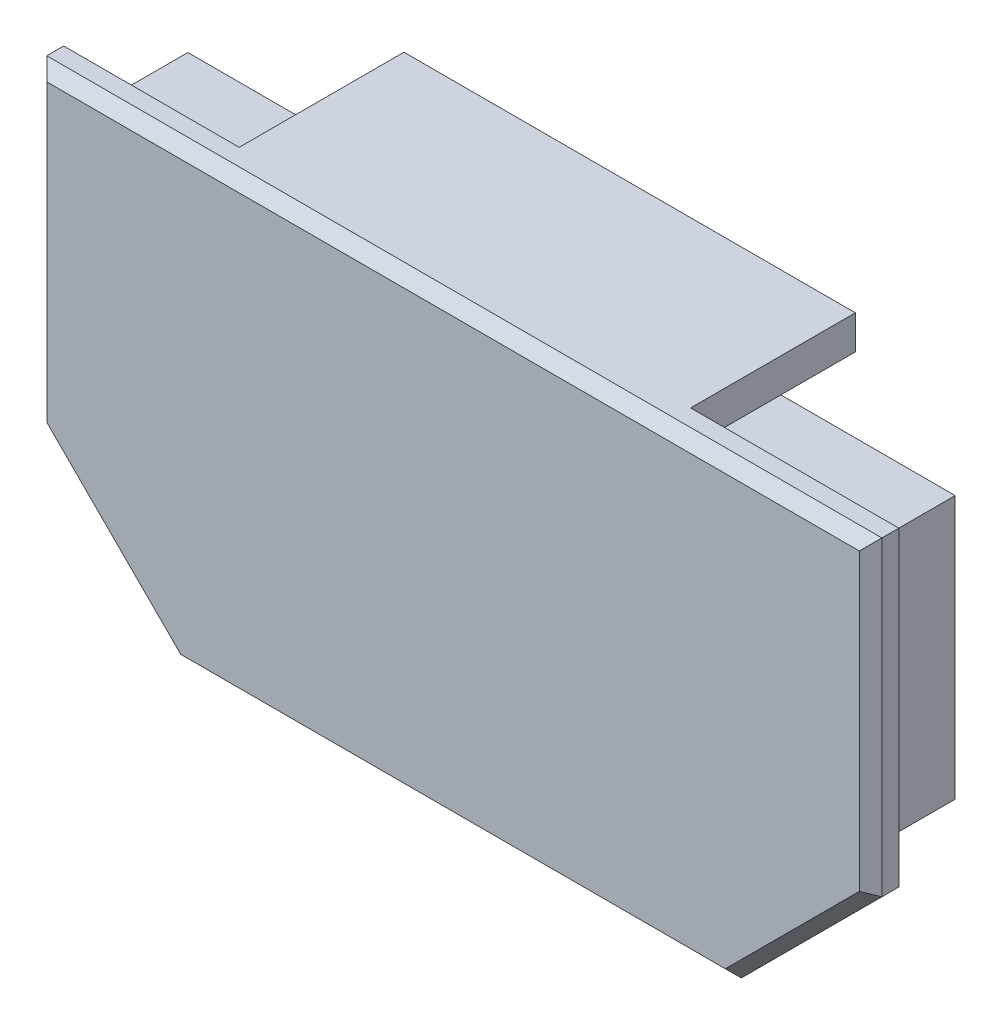
ISO-10303-21;
HEADER;
FILE_DESCRIPTION(('STEP AP214'),'2;1');
FILE_NAME('part.step','',(''),(''),'','','');
FILE_SCHEMA(('AUTOMOTIVE_DESIGN { 1 0 10303 214 1 1 1 1 }'));
ENDSEC;
DATA;
#1=APPLICATION_CONTEXT('core data for automotive mechanical design processes');
#2=APPLICATION_PROTOCOL_DEFINITION('international standard','automotive_design',2000,#1);
#3=PRODUCT_CONTEXT('',#1,'mechanical');
#4=PRODUCT('Part','Part','',(#3));
#5=PRODUCT_RELATED_PRODUCT_CATEGORY('part','',(#4));
#6=PRODUCT_DEFINITION_FORMATION('','',#4);
#7=PRODUCT_DEFINITION_CONTEXT('part definition',#1,'design');
#8=PRODUCT_DEFINITION('design','',#6,#7);
#9=PRODUCT_DEFINITION_SHAPE('','',#8);
#10=(LENGTH_UNIT() NAMED_UNIT(*) SI_UNIT(.MILLI.,.METRE.));
#11=(NAMED_UNIT(*) PLANE_ANGLE_UNIT() SI_UNIT($,.RADIAN.));
#12=(NAMED_UNIT(*) SI_UNIT($,.STERADIAN.) SOLID_ANGLE_UNIT());
#13=UNCERTAINTY_MEASURE_WITH_UNIT(LENGTH_MEASURE(1.E-05),#10,'distance_accuracy_value','');
#14=(GEOMETRIC_REPRESENTATION_CONTEXT(3) GLOBAL_UNCERTAINTY_ASSIGNED_CONTEXT((#13)) GLOBAL_UNIT_ASSIGNED_CONTEXT((#10,
#11,#12)) REPRESENTATION_CONTEXT('',''));
#15=CARTESIAN_POINT('',(0.,0.,0.));
#16=DIRECTION('',(0.,0.,1.));
#17=DIRECTION('',(1.,0.,0.));
#18=AXIS2_PLACEMENT_3D('',#15,#16,#17);
#19=CARTESIAN_POINT('',(-34.,17.,-8.));
#20=DIRECTION('',(0.,1.,0.));
#21=DIRECTION('',(0.,0.,1.));
#22=AXIS2_PLACEMENT_3D('',#19,#20,#21);
#23=PLANE('',#22);
#24=DIRECTION('',(-1.,0.,0.));
#25=VECTOR('',#24,1.);
#26=CARTESIAN_POINT('',(-34.,17.,-8.));
#27=LINE('',#26,#25);
#28=CARTESIAN_POINT('',(34.,17.,-8.));
#29=VERTEX_POINT('',#28);
#30=CARTESIAN_POINT('',(18.55,17.,-8.));
#31=VERTEX_POINT('',#30);
#32=EDGE_CURVE('E388',#29,#31,#27,.T.);
#33=ORIENTED_EDGE('',*,*,#32,.T.);
#34=DIRECTION('',(0.,0.,1.));
#35=VECTOR('',#34,1.);
#36=CARTESIAN_POINT('',(18.55,17.,-14.6));
#37=LINE('',#36,#35);
#38=CARTESIAN_POINT('',(18.55,17.,0.));
#39=VERTEX_POINT('',#38);
#40=EDGE_CURVE('E261',#31,#39,#37,.T.);
#41=ORIENTED_EDGE('',*,*,#40,.T.);
#42=DIRECTION('',(-1.,0.,0.));
#43=VECTOR('',#42,1.);
#44=CARTESIAN_POINT('',(-34.,17.,0.));
#45=LINE('',#44,#43);
#46=CARTESIAN_POINT('',(34.,17.,0.));
#47=VERTEX_POINT('',#46);
#48=EDGE_CURVE('E409',#47,#39,#45,.T.);
#49=ORIENTED_EDGE('',*,*,#48,.F.);
#50=DIRECTION('',(0.,0.,1.));
#51=VECTOR('',#50,1.);
#52=CARTESIAN_POINT('',(34.,17.,-8.));
#53=LINE('',#52,#51);
#54=EDGE_CURVE('E431',#29,#47,#53,.T.);
#55=ORIENTED_EDGE('',*,*,#54,.F.);
#56=EDGE_LOOP('',(#33,#41,#49,#55));
#57=FACE_BOUND('',#56,.T.);
#58=ADVANCED_FACE('F41',(#57),#23,.T.);
#59=CARTESIAN_POINT('',(-21.45,17.,0.));
#60=VERTEX_POINT('',#59);
#61=CARTESIAN_POINT('',(-34.,17.,0.));
#62=VERTEX_POINT('',#61);
#63=EDGE_CURVE('E407',#60,#62,#45,.T.);
#64=ORIENTED_EDGE('',*,*,#63,.F.);
#65=DIRECTION('',(0.,0.,1.));
#66=VECTOR('',#65,1.);
#67=CARTESIAN_POINT('',(-21.45,17.,-14.6));
#68=LINE('',#67,#66);
#69=CARTESIAN_POINT('',(-21.45,17.,-8.));
#70=VERTEX_POINT('',#69);
#71=EDGE_CURVE('E614',#70,#60,#68,.T.);
#72=ORIENTED_EDGE('',*,*,#71,.F.);
#73=CARTESIAN_POINT('',(-34.,17.,-8.));
#74=VERTEX_POINT('',#73);
#75=EDGE_CURVE('E389',#70,#74,#27,.T.);
#76=ORIENTED_EDGE('',*,*,#75,.T.);
#77=DIRECTION('',(0.,0.,1.));
#78=VECTOR('',#77,1.);
#79=CARTESIAN_POINT('',(-34.,17.,-8.));
#80=LINE('',#79,#78);
#81=EDGE_CURVE('E426',#74,#62,#80,.T.);
#82=ORIENTED_EDGE('',*,*,#81,.T.);
#83=EDGE_LOOP('',(#64,#72,#76,#82));
#84=FACE_BOUND('',#83,.T.);
#85=ADVANCED_FACE('F542',(#84),#23,.T.);
#86=CARTESIAN_POINT('',(0.,0.,0.));
#87=DIRECTION('',(0.,0.,1.));
#88=DIRECTION('',(1.,0.,0.));
#89=AXIS2_PLACEMENT_3D('',#86,#87,#88);
#90=PLANE('',#89);
#91=DIRECTION('',(0.,-1.,0.));
#92=VECTOR('',#91,1.);
#93=CARTESIAN_POINT('',(18.55,20.,0.));
#94=LINE('',#93,#92);
#95=CARTESIAN_POINT('',(18.55,20.,0.));
#96=VERTEX_POINT('',#95);
#97=EDGE_CURVE('E615',#96,#39,#94,.T.);
#98=ORIENTED_EDGE('',*,*,#97,.F.);
#99=DIRECTION('',(-1.,0.,0.));
#100=VECTOR('',#99,1.);
#101=CARTESIAN_POINT('',(-37.,20.,0.));
#102=LINE('',#101,#100);
#103=CARTESIAN_POINT('',(37.,20.,0.));
#104=VERTEX_POINT('',#103);
#105=EDGE_CURVE('E303',#104,#96,#102,.T.);
#106=ORIENTED_EDGE('',*,*,#105,.F.);
#107=DIRECTION('',(0.,1.,0.));
#108=VECTOR('',#107,1.);
#109=CARTESIAN_POINT('',(37.,-7.54264068711929,0.));
#110=LINE('',#109,#108);
#111=CARTESIAN_POINT('',(37.,-7.54264068711929,0.));
#112=VERTEX_POINT('',#111);
#113=EDGE_CURVE('E299',#112,#104,#110,.T.);
#114=ORIENTED_EDGE('',*,*,#113,.F.);
#115=DIRECTION('',(0.707106781186547,0.707106781186547,0.));
#116=VECTOR('',#115,1.);
#117=CARTESIAN_POINT('',(24.5426406871193,-20.,0.));
#118=LINE('',#117,#116);
#119=CARTESIAN_POINT('',(24.5426406871193,-20.,0.));
#120=VERTEX_POINT('',#119);
#121=EDGE_CURVE('E294',#120,#112,#118,.T.);
#122=ORIENTED_EDGE('',*,*,#121,.F.);
#123=DIRECTION('',(1.,0.,0.));
#124=VECTOR('',#123,1.);
#125=CARTESIAN_POINT('',(-24.5426406871193,-20.,0.));
#126=LINE('',#125,#124);
#127=CARTESIAN_POINT('',(4.,-20.,0.));
#128=VERTEX_POINT('',#127);
#129=EDGE_CURVE('E298',#128,#120,#126,.T.);
#130=ORIENTED_EDGE('',*,*,#129,.F.);
#131=DIRECTION('',(0.,-1.,0.));
#132=VECTOR('',#131,1.);
#133=CARTESIAN_POINT('',(4.,-8.93774225170146,0.));
#134=LINE('',#133,#132);
#135=CARTESIAN_POINT('',(4.,-17.,0.));
#136=VERTEX_POINT('',#135);
#137=EDGE_CURVE('E287',#136,#128,#134,.T.);
#138=ORIENTED_EDGE('',*,*,#137,.F.);
#139=DIRECTION('',(1.,0.,0.));
#140=VECTOR('',#139,1.);
#141=CARTESIAN_POINT('',(-23.3,-17.,0.));
#142=LINE('',#141,#140);
#143=CARTESIAN_POINT('',(23.3,-17.,0.));
#144=VERTEX_POINT('',#143);
#145=EDGE_CURVE('E420',#136,#144,#142,.T.);
#146=ORIENTED_EDGE('',*,*,#145,.T.);
#147=DIRECTION('',(0.707106781186547,0.707106781186547,0.));
#148=VECTOR('',#147,1.);
#149=CARTESIAN_POINT('',(23.3,-17.,0.));
#150=LINE('',#149,#148);
#151=CARTESIAN_POINT('',(34.,-6.30000000000001,0.));
#152=VERTEX_POINT('',#151);
#153=EDGE_CURVE('E366',#144,#152,#150,.T.);
#154=ORIENTED_EDGE('',*,*,#153,.T.);
#155=DIRECTION('',(0.,1.,0.));
#156=VECTOR('',#155,1.);
#157=CARTESIAN_POINT('',(34.,-6.30000000000001,0.));
#158=LINE('',#157,#156);
#159=EDGE_CURVE('E404',#152,#47,#158,.T.);
#160=ORIENTED_EDGE('',*,*,#159,.T.);
#161=ORIENTED_EDGE('',*,*,#48,.T.);
#162=EDGE_LOOP('',(#98,#106,#114,#122,#130,#138,#146,#154,#160,#161));
#163=FACE_BOUND('',#162,.T.);
#164=ADVANCED_FACE('F489',(#163),#90,.F.);
#165=DIRECTION('',(0.,1.,0.));
#166=VECTOR('',#165,1.);
#167=CARTESIAN_POINT('',(-21.45,20.,0.));
#168=LINE('',#167,#166);
#169=CARTESIAN_POINT('',(-21.45,20.,0.));
#170=VERTEX_POINT('',#169);
#171=EDGE_CURVE('E258',#60,#170,#168,.T.);
#172=ORIENTED_EDGE('',*,*,#171,.F.);
#173=ORIENTED_EDGE('',*,*,#63,.T.);
#174=DIRECTION('',(0.,-1.,0.));
#175=VECTOR('',#174,1.);
#176=CARTESIAN_POINT('',(-34.,17.,0.));
#177=LINE('',#176,#175);
#178=CARTESIAN_POINT('',(-34.,-6.30000000000002,0.));
#179=VERTEX_POINT('',#178);
#180=EDGE_CURVE('E413',#62,#179,#177,.T.);
#181=ORIENTED_EDGE('',*,*,#180,.T.);
#182=DIRECTION('',(0.707106781186548,-0.707106781186547,0.));
#183=VECTOR('',#182,1.);
#184=CARTESIAN_POINT('',(-34.,-6.30000000000002,0.));
#185=LINE('',#184,#183);
#186=CARTESIAN_POINT('',(-23.3,-17.,0.));
#187=VERTEX_POINT('',#186);
#188=EDGE_CURVE('E412',#179,#187,#185,.T.);
#189=ORIENTED_EDGE('',*,*,#188,.T.);
#190=CARTESIAN_POINT('',(-4.,-17.,0.));
#191=VERTEX_POINT('',#190);
#192=EDGE_CURVE('E383',#187,#191,#142,.T.);
#193=ORIENTED_EDGE('',*,*,#192,.T.);
#194=DIRECTION('',(0.,-1.,0.));
#195=VECTOR('',#194,1.);
#196=CARTESIAN_POINT('',(-4.,-8.93774225170146,0.));
#197=LINE('',#196,#195);
#198=CARTESIAN_POINT('',(-4.,-20.,0.));
#199=VERTEX_POINT('',#198);
#200=EDGE_CURVE('E70',#191,#199,#197,.T.);
#201=ORIENTED_EDGE('',*,*,#200,.T.);
#202=CARTESIAN_POINT('',(-24.5426406871193,-20.,0.));
#203=VERTEX_POINT('',#202);
#204=EDGE_CURVE('E292',#203,#199,#126,.T.);
#205=ORIENTED_EDGE('',*,*,#204,.F.);
#206=DIRECTION('',(0.707106781186547,-0.707106781186547,0.));
#207=VECTOR('',#206,1.);
#208=CARTESIAN_POINT('',(-37.,-7.54264068711929,0.));
#209=LINE('',#208,#207);
#210=CARTESIAN_POINT('',(-37.,-7.54264068711929,0.));
#211=VERTEX_POINT('',#210);
#212=EDGE_CURVE('E307',#211,#203,#209,.T.);
#213=ORIENTED_EDGE('',*,*,#212,.F.);
#214=DIRECTION('',(0.,-1.,0.));
#215=VECTOR('',#214,1.);
#216=CARTESIAN_POINT('',(-37.,20.,0.));
#217=LINE('',#216,#215);
#218=CARTESIAN_POINT('',(-37.,20.,0.));
#219=VERTEX_POINT('',#218);
#220=EDGE_CURVE('E306',#219,#211,#217,.T.);
#221=ORIENTED_EDGE('',*,*,#220,.F.);
#222=EDGE_CURVE('E305',#170,#219,#102,.T.);
#223=ORIENTED_EDGE('',*,*,#222,.F.);
#224=EDGE_LOOP('',(#172,#173,#181,#189,#193,#201,#205,#213,#221,#223));
#225=FACE_BOUND('',#224,.T.);
#226=ADVANCED_FACE('F564',(#225),#90,.F.);
#227=CARTESIAN_POINT('',(23.3,-17.,-8.));
#228=DIRECTION('',(0.707106781186547,-0.707106781186547,0.));
#229=DIRECTION('',(0.707106781186548,0.707106781186548,0.));
#230=AXIS2_PLACEMENT_3D('',#227,#228,#229);
#231=PLANE('',#230);
#232=ORIENTED_EDGE('',*,*,#153,.F.);
#233=DIRECTION('',(0.,0.,1.));
#234=VECTOR('',#233,1.);
#235=CARTESIAN_POINT('',(23.3,-17.,-8.));
#236=LINE('',#235,#234);
#237=CARTESIAN_POINT('',(23.3,-17.,-8.));
#238=VERTEX_POINT('',#237);
#239=EDGE_CURVE('E419',#238,#144,#236,.T.);
#240=ORIENTED_EDGE('',*,*,#239,.F.);
#241=DIRECTION('',(0.707106781186547,0.707106781186547,0.));
#242=VECTOR('',#241,1.);
#243=CARTESIAN_POINT('',(23.3,-17.,-8.));
#244=LINE('',#243,#242);
#245=CARTESIAN_POINT('',(34.,-6.30000000000001,-8.));
#246=VERTEX_POINT('',#245);
#247=EDGE_CURVE('E382',#238,#246,#244,.T.);
#248=ORIENTED_EDGE('',*,*,#247,.T.);
#249=DIRECTION('',(0.,0.,1.));
#250=VECTOR('',#249,1.);
#251=CARTESIAN_POINT('',(34.,-6.30000000000001,-8.));
#252=LINE('',#251,#250);
#253=EDGE_CURVE('E402',#246,#152,#252,.T.);
#254=ORIENTED_EDGE('',*,*,#253,.T.);
#255=EDGE_LOOP('',(#232,#240,#248,#254));
#256=FACE_BOUND('',#255,.T.);
#257=ADVANCED_FACE('F561',(#256),#231,.T.);
#258=CARTESIAN_POINT('',(-23.3,-17.,-8.));
#259=DIRECTION('',(0.,-1.,0.));
#260=DIRECTION('',(1.,0.,0.));
#261=AXIS2_PLACEMENT_3D('',#258,#259,#260);
#262=PLANE('',#261);
#263=ORIENTED_EDGE('',*,*,#192,.F.);
#264=DIRECTION('',(0.,0.,1.));
#265=VECTOR('',#264,1.);
#266=CARTESIAN_POINT('',(-23.3,-17.,-8.));
#267=LINE('',#266,#265);
#268=CARTESIAN_POINT('',(-23.3,-17.,-8.));
#269=VERTEX_POINT('',#268);
#270=EDGE_CURVE('E425',#269,#187,#267,.T.);
#271=ORIENTED_EDGE('',*,*,#270,.F.);
#272=DIRECTION('',(1.,0.,0.));
#273=VECTOR('',#272,1.);
#274=CARTESIAN_POINT('',(-23.3,-17.,-8.));
#275=LINE('',#274,#273);
#276=EDGE_CURVE('E396',#269,#238,#275,.T.);
#277=ORIENTED_EDGE('',*,*,#276,.T.);
#278=ORIENTED_EDGE('',*,*,#239,.T.);
#279=ORIENTED_EDGE('',*,*,#145,.F.);
#280=DIRECTION('',(0.866025403784442,0.,-0.499999999999995));
#281=VECTOR('',#280,1.);
#282=CARTESIAN_POINT('',(4.,-17.,0.));
#283=LINE('',#282,#281);
#284=CARTESIAN_POINT('',(2.2679491924311,-17.,1.));
#285=VERTEX_POINT('',#284);
#286=EDGE_CURVE('E272',#285,#136,#283,.T.);
#287=ORIENTED_EDGE('',*,*,#286,.F.);
#288=DIRECTION('',(1.,0.,0.));
#289=VECTOR('',#288,1.);
#290=CARTESIAN_POINT('',(2.2679491924311,-17.,1.));
#291=LINE('',#290,#289);
#292=CARTESIAN_POINT('',(-2.2679491924311,-17.,1.));
#293=VERTEX_POINT('',#292);
#294=EDGE_CURVE('E271',#293,#285,#291,.T.);
#295=ORIENTED_EDGE('',*,*,#294,.F.);
#296=DIRECTION('',(0.866025403784442,0.,0.499999999999995));
#297=VECTOR('',#296,1.);
#298=CARTESIAN_POINT('',(-2.2679491924311,-17.,1.));
#299=LINE('',#298,#297);
#300=EDGE_CURVE('E276',#191,#293,#299,.T.);
#301=ORIENTED_EDGE('',*,*,#300,.F.);
#302=EDGE_LOOP('',(#263,#271,#277,#278,#279,#287,#295,#301));
#303=FACE_BOUND('',#302,.T.);
#304=ADVANCED_FACE('F562',(#303),#262,.T.);
#305=CARTESIAN_POINT('',(-34.,-6.30000000000002,-8.));
#306=DIRECTION('',(-0.707106781186547,-0.707106781186548,0.));
#307=DIRECTION('',(0.707106781186548,-0.707106781186547,0.));
#308=AXIS2_PLACEMENT_3D('',#305,#306,#307);
#309=PLANE('',#308);
#310=ORIENTED_EDGE('',*,*,#188,.F.);
#311=DIRECTION('',(0.,0.,1.));
#312=VECTOR('',#311,1.);
#313=CARTESIAN_POINT('',(-34.,-6.30000000000002,-8.));
#314=LINE('',#313,#312);
#315=CARTESIAN_POINT('',(-34.,-6.30000000000002,-8.));
#316=VERTEX_POINT('',#315);
#317=EDGE_CURVE('E428',#316,#179,#314,.T.);
#318=ORIENTED_EDGE('',*,*,#317,.F.);
#319=DIRECTION('',(0.707106781186548,-0.707106781186547,0.));
#320=VECTOR('',#319,1.);
#321=CARTESIAN_POINT('',(-34.,-6.30000000000002,-8.));
#322=LINE('',#321,#320);
#323=EDGE_CURVE('E394',#316,#269,#322,.T.);
#324=ORIENTED_EDGE('',*,*,#323,.T.);
#325=ORIENTED_EDGE('',*,*,#270,.T.);
#326=EDGE_LOOP('',(#310,#318,#324,#325));
#327=FACE_BOUND('',#326,.T.);
#328=ADVANCED_FACE('F624',(#327),#309,.T.);
#329=CARTESIAN_POINT('',(-34.,17.,-8.));
#330=DIRECTION('',(-1.,0.,0.));
#331=DIRECTION('',(0.,-1.,0.));
#332=AXIS2_PLACEMENT_3D('',#329,#330,#331);
#333=PLANE('',#332);
#334=ORIENTED_EDGE('',*,*,#180,.F.);
#335=ORIENTED_EDGE('',*,*,#81,.F.);
#336=DIRECTION('',(0.,-1.,0.));
#337=VECTOR('',#336,1.);
#338=CARTESIAN_POINT('',(-34.,17.,-8.));
#339=LINE('',#338,#337);
#340=EDGE_CURVE('E395',#74,#316,#339,.T.);
#341=ORIENTED_EDGE('',*,*,#340,.T.);
#342=ORIENTED_EDGE('',*,*,#317,.T.);
#343=EDGE_LOOP('',(#334,#335,#341,#342));
#344=FACE_BOUND('',#343,.T.);
#345=ADVANCED_FACE('F555',(#344),#333,.T.);
#346=CARTESIAN_POINT('',(34.,-6.30000000000001,-8.));
#347=DIRECTION('',(1.,0.,0.));
#348=DIRECTION('',(0.,0.,-1.));
#349=AXIS2_PLACEMENT_3D('',#346,#347,#348);
#350=PLANE('',#349);
#351=ORIENTED_EDGE('',*,*,#159,.F.);
#352=ORIENTED_EDGE('',*,*,#253,.F.);
#353=DIRECTION('',(0.,1.,0.));
#354=VECTOR('',#353,1.);
#355=CARTESIAN_POINT('',(34.,-6.30000000000001,-8.));
#356=LINE('',#355,#354);
#357=EDGE_CURVE('E381',#246,#29,#356,.T.);
#358=ORIENTED_EDGE('',*,*,#357,.T.);
#359=ORIENTED_EDGE('',*,*,#54,.T.);
#360=EDGE_LOOP('',(#351,#352,#358,#359));
#361=FACE_BOUND('',#360,.T.);
#362=ADVANCED_FACE('F558',(#361),#350,.T.);
#363=CARTESIAN_POINT('',(0.,0.,-8.));
#364=DIRECTION('',(0.,0.,-1.));
#365=DIRECTION('',(-1.,0.,0.));
#366=AXIS2_PLACEMENT_3D('',#363,#364,#365);
#367=PLANE('',#366);
#368=DIRECTION('',(0.707106781186548,0.707106781186548,0.));
#369=VECTOR('',#368,1.);
#370=CARTESIAN_POINT('',(22.4715728752538,-15.,-8.));
#371=LINE('',#370,#369);
#372=CARTESIAN_POINT('',(22.4715728752538,-15.,-8.));
#373=VERTEX_POINT('',#372);
#374=CARTESIAN_POINT('',(32.,-5.47157287525382,-8.));
#375=VERTEX_POINT('',#374);
#376=EDGE_CURVE('E330',#373,#375,#371,.T.);
#377=ORIENTED_EDGE('',*,*,#376,.T.);
#378=DIRECTION('',(0.,1.,0.));
#379=VECTOR('',#378,1.);
#380=CARTESIAN_POINT('',(32.,-5.47157287525382,-8.));
#381=LINE('',#380,#379);
#382=CARTESIAN_POINT('',(32.,15.,-8.));
#383=VERTEX_POINT('',#382);
#384=EDGE_CURVE('E329',#375,#383,#381,.T.);
#385=ORIENTED_EDGE('',*,*,#384,.T.);
#386=DIRECTION('',(-1.,0.,0.));
#387=VECTOR('',#386,1.);
#388=CARTESIAN_POINT('',(-32.,15.,-8.));
#389=LINE('',#388,#387);
#390=CARTESIAN_POINT('',(-32.,15.,-8.));
#391=VERTEX_POINT('',#390);
#392=EDGE_CURVE('E332',#383,#391,#389,.T.);
#393=ORIENTED_EDGE('',*,*,#392,.T.);
#394=DIRECTION('',(0.,-1.,0.));
#395=VECTOR('',#394,1.);
#396=CARTESIAN_POINT('',(-32.,15.,-8.));
#397=LINE('',#396,#395);
#398=CARTESIAN_POINT('',(-32.,-5.47157287525383,-8.));
#399=VERTEX_POINT('',#398);
#400=EDGE_CURVE('E340',#391,#399,#397,.T.);
#401=ORIENTED_EDGE('',*,*,#400,.T.);
#402=DIRECTION('',(0.707106781186548,-0.707106781186547,0.));
#403=VECTOR('',#402,1.);
#404=CARTESIAN_POINT('',(-32.,-5.47157287525383,-8.));
#405=LINE('',#404,#403);
#406=CARTESIAN_POINT('',(-22.4715728752538,-15.,-8.));
#407=VERTEX_POINT('',#406);
#408=EDGE_CURVE('E338',#399,#407,#405,.T.);
#409=ORIENTED_EDGE('',*,*,#408,.T.);
#410=DIRECTION('',(1.,0.,0.));
#411=VECTOR('',#410,1.);
#412=CARTESIAN_POINT('',(-22.4715728752538,-15.,-8.));
#413=LINE('',#412,#411);
#414=EDGE_CURVE('E344',#407,#373,#413,.T.);
#415=ORIENTED_EDGE('',*,*,#414,.T.);
#416=EDGE_LOOP('',(#377,#385,#393,#401,#409,#415));
#417=FACE_BOUND('',#416,.T.);
#418=ORIENTED_EDGE('',*,*,#247,.F.);
#419=ORIENTED_EDGE('',*,*,#276,.F.);
#420=ORIENTED_EDGE('',*,*,#323,.F.);
#421=ORIENTED_EDGE('',*,*,#340,.F.);
#422=ORIENTED_EDGE('',*,*,#75,.F.);
#423=DIRECTION('',(1.,0.,0.));
#424=VECTOR('',#423,1.);
#425=CARTESIAN_POINT('',(0.,17.,-8.));
#426=LINE('',#425,#424);
#427=EDGE_CURVE('E262',#70,#31,#426,.T.);
#428=ORIENTED_EDGE('',*,*,#427,.T.);
#429=ORIENTED_EDGE('',*,*,#32,.F.);
#430=ORIENTED_EDGE('',*,*,#357,.F.);
#431=EDGE_LOOP('',(#418,#419,#420,#421,#422,#428,#429,#430));
#432=FACE_BOUND('',#431,.T.);
#433=ADVANCED_FACE('F559',(#417,#432),#367,.T.);
#434=CARTESIAN_POINT('',(22.4715728752538,-15.,-8.));
#435=DIRECTION('',(0.707106781186547,-0.707106781186547,0.));
#436=DIRECTION('',(0.707106781186548,0.707106781186548,0.));
#437=AXIS2_PLACEMENT_3D('',#434,#435,#436);
#438=PLANE('',#437);
#439=DIRECTION('',(0.707106781186548,0.707106781186548,0.));
#440=VECTOR('',#439,1.);
#441=CARTESIAN_POINT('',(22.4715728752538,-15.,0.));
#442=LINE('',#441,#440);
#443=CARTESIAN_POINT('',(22.4715728752538,-15.,0.));
#444=VERTEX_POINT('',#443);
#445=CARTESIAN_POINT('',(32.,-5.47157287525382,0.));
#446=VERTEX_POINT('',#445);
#447=EDGE_CURVE('E328',#444,#446,#442,.T.);
#448=ORIENTED_EDGE('',*,*,#447,.T.);
#449=DIRECTION('',(0.,0.,1.));
#450=VECTOR('',#449,1.);
#451=CARTESIAN_POINT('',(32.,-5.47157287525382,-8.));
#452=LINE('',#451,#450);
#453=EDGE_CURVE('E348',#375,#446,#452,.T.);
#454=ORIENTED_EDGE('',*,*,#453,.F.);
#455=ORIENTED_EDGE('',*,*,#376,.F.);
#456=DIRECTION('',(0.,0.,1.));
#457=VECTOR('',#456,1.);
#458=CARTESIAN_POINT('',(22.4715728752538,-15.,-8.));
#459=LINE('',#458,#457);
#460=EDGE_CURVE('E361',#373,#444,#459,.T.);
#461=ORIENTED_EDGE('',*,*,#460,.T.);
#462=EDGE_LOOP('',(#448,#454,#455,#461));
#463=FACE_BOUND('',#462,.T.);
#464=ADVANCED_FACE('F737',(#463),#438,.F.);
#465=CARTESIAN_POINT('',(-22.4715728752538,-15.,-8.));
#466=DIRECTION('',(0.,-1.,0.));
#467=DIRECTION('',(1.,0.,0.));
#468=AXIS2_PLACEMENT_3D('',#465,#466,#467);
#469=PLANE('',#468);
#470=DIRECTION('',(1.,0.,0.));
#471=VECTOR('',#470,1.);
#472=CARTESIAN_POINT('',(-22.4715728752538,-15.,0.));
#473=LINE('',#472,#471);
#474=CARTESIAN_POINT('',(-22.4715728752538,-15.,0.));
#475=VERTEX_POINT('',#474);
#476=EDGE_CURVE('E333',#475,#444,#473,.T.);
#477=ORIENTED_EDGE('',*,*,#476,.T.);
#478=ORIENTED_EDGE('',*,*,#460,.F.);
#479=ORIENTED_EDGE('',*,*,#414,.F.);
#480=DIRECTION('',(0.,0.,1.));
#481=VECTOR('',#480,1.);
#482=CARTESIAN_POINT('',(-22.4715728752538,-15.,-8.));
#483=LINE('',#482,#481);
#484=EDGE_CURVE('E370',#407,#475,#483,.T.);
#485=ORIENTED_EDGE('',*,*,#484,.T.);
#486=EDGE_LOOP('',(#477,#478,#479,#485));
#487=FACE_BOUND('',#486,.T.);
#488=ADVANCED_FACE('F760',(#487),#469,.F.);
#489=CARTESIAN_POINT('',(-32.,-5.47157287525383,-8.));
#490=DIRECTION('',(-0.707106781186547,-0.707106781186548,0.));
#491=DIRECTION('',(0.707106781186548,-0.707106781186547,0.));
#492=AXIS2_PLACEMENT_3D('',#489,#490,#491);
#493=PLANE('',#492);
#494=DIRECTION('',(0.707106781186548,-0.707106781186547,0.));
#495=VECTOR('',#494,1.);
#496=CARTESIAN_POINT('',(-32.,-5.47157287525383,0.));
#497=LINE('',#496,#495);
#498=CARTESIAN_POINT('',(-32.,-5.47157287525383,0.));
#499=VERTEX_POINT('',#498);
#500=EDGE_CURVE('E356',#499,#475,#497,.T.);
#501=ORIENTED_EDGE('',*,*,#500,.T.);
#502=ORIENTED_EDGE('',*,*,#484,.F.);
#503=ORIENTED_EDGE('',*,*,#408,.F.);
#504=DIRECTION('',(0.,0.,1.));
#505=VECTOR('',#504,1.);
#506=CARTESIAN_POINT('',(-32.,-5.47157287525383,-8.));
#507=LINE('',#506,#505);
#508=EDGE_CURVE('E369',#399,#499,#507,.T.);
#509=ORIENTED_EDGE('',*,*,#508,.T.);
#510=EDGE_LOOP('',(#501,#502,#503,#509));
#511=FACE_BOUND('',#510,.T.);
#512=ADVANCED_FACE('F770',(#511),#493,.F.);
#513=CARTESIAN_POINT('',(-32.,15.,-8.));
#514=DIRECTION('',(-1.,0.,0.));
#515=DIRECTION('',(0.,-1.,0.));
#516=AXIS2_PLACEMENT_3D('',#513,#514,#515);
#517=PLANE('',#516);
#518=DIRECTION('',(0.,-1.,0.));
#519=VECTOR('',#518,1.);
#520=CARTESIAN_POINT('',(-32.,15.,0.));
#521=LINE('',#520,#519);
#522=CARTESIAN_POINT('',(-32.,15.,0.));
#523=VERTEX_POINT('',#522);
#524=EDGE_CURVE('E354',#523,#499,#521,.T.);
#525=ORIENTED_EDGE('',*,*,#524,.T.);
#526=ORIENTED_EDGE('',*,*,#508,.F.);
#527=ORIENTED_EDGE('',*,*,#400,.F.);
#528=DIRECTION('',(0.,0.,1.));
#529=VECTOR('',#528,1.);
#530=CARTESIAN_POINT('',(-32.,15.,-8.));
#531=LINE('',#530,#529);
#532=EDGE_CURVE('E373',#391,#523,#531,.T.);
#533=ORIENTED_EDGE('',*,*,#532,.T.);
#534=EDGE_LOOP('',(#525,#526,#527,#533));
#535=FACE_BOUND('',#534,.T.);
#536=ADVANCED_FACE('F777',(#535),#517,.F.);
#537=CARTESIAN_POINT('',(-32.,15.,-8.));
#538=DIRECTION('',(0.,1.,0.));
#539=DIRECTION('',(0.,0.,1.));
#540=AXIS2_PLACEMENT_3D('',#537,#538,#539);
#541=PLANE('',#540);
#542=DIRECTION('',(-1.,0.,0.));
#543=VECTOR('',#542,1.);
#544=CARTESIAN_POINT('',(-32.,15.,0.));
#545=LINE('',#544,#543);
#546=CARTESIAN_POINT('',(32.,15.,0.));
#547=VERTEX_POINT('',#546);
#548=EDGE_CURVE('E355',#547,#523,#545,.T.);
#549=ORIENTED_EDGE('',*,*,#548,.T.);
#550=ORIENTED_EDGE('',*,*,#532,.F.);
#551=ORIENTED_EDGE('',*,*,#392,.F.);
#552=DIRECTION('',(0.,0.,1.));
#553=VECTOR('',#552,1.);
#554=CARTESIAN_POINT('',(32.,15.,-8.));
#555=LINE('',#554,#553);
#556=EDGE_CURVE('E376',#383,#547,#555,.T.);
#557=ORIENTED_EDGE('',*,*,#556,.T.);
#558=EDGE_LOOP('',(#549,#550,#551,#557));
#559=FACE_BOUND('',#558,.T.);
#560=ADVANCED_FACE('F539',(#559),#541,.F.);
#561=CARTESIAN_POINT('',(32.,-5.47157287525382,-8.));
#562=DIRECTION('',(1.,0.,0.));
#563=DIRECTION('',(0.,1.,0.));
#564=AXIS2_PLACEMENT_3D('',#561,#562,#563);
#565=PLANE('',#564);
#566=DIRECTION('',(0.,1.,0.));
#567=VECTOR('',#566,1.);
#568=CARTESIAN_POINT('',(32.,-5.47157287525382,0.));
#569=LINE('',#568,#567);
#570=EDGE_CURVE('E347',#446,#547,#569,.T.);
#571=ORIENTED_EDGE('',*,*,#570,.T.);
#572=ORIENTED_EDGE('',*,*,#556,.F.);
#573=ORIENTED_EDGE('',*,*,#384,.F.);
#574=ORIENTED_EDGE('',*,*,#453,.T.);
#575=EDGE_LOOP('',(#571,#572,#573,#574));
#576=FACE_BOUND('',#575,.T.);
#577=ADVANCED_FACE('F529',(#576),#565,.F.);
#578=CARTESIAN_POINT('',(0.,0.,2.5));
#579=DIRECTION('',(0.,0.,1.));
#580=DIRECTION('',(1.,0.,0.));
#581=AXIS2_PLACEMENT_3D('',#578,#579,#580);
#582=PLANE('',#581);
#583=DIRECTION('',(0.,-1.,0.));
#584=VECTOR('',#583,1.);
#585=CARTESIAN_POINT('',(-36.,-7.54264068711929,2.5));
#586=LINE('',#585,#584);
#587=CARTESIAN_POINT('',(-36.,19.,2.5));
#588=VERTEX_POINT('',#587);
#589=CARTESIAN_POINT('',(-36.,-7.12842712474619,2.5));
#590=VERTEX_POINT('',#589);
#591=EDGE_CURVE('E441',#588,#590,#586,.T.);
#592=ORIENTED_EDGE('',*,*,#591,.T.);
#593=DIRECTION('',(0.707106781186548,-0.707106781186548,0.));
#594=VECTOR('',#593,1.);
#595=CARTESIAN_POINT('',(-23.8355339059327,-19.2928932188134,2.5));
#596=LINE('',#595,#594);
#597=CARTESIAN_POINT('',(-24.1284271247462,-19.,2.5));
#598=VERTEX_POINT('',#597);
#599=EDGE_CURVE('E442',#590,#598,#596,.T.);
#600=ORIENTED_EDGE('',*,*,#599,.T.);
#601=DIRECTION('',(1.,0.,0.));
#602=VECTOR('',#601,1.);
#603=CARTESIAN_POINT('',(24.5426406871193,-19.,2.5));
#604=LINE('',#603,#602);
#605=CARTESIAN_POINT('',(24.1284271247462,-19.,2.5));
#606=VERTEX_POINT('',#605);
#607=EDGE_CURVE('E421',#598,#606,#604,.T.);
#608=ORIENTED_EDGE('',*,*,#607,.T.);
#609=DIRECTION('',(0.707106781186548,0.707106781186548,0.));
#610=VECTOR('',#609,1.);
#611=CARTESIAN_POINT('',(36.2928932188134,-6.83553390593273,2.5));
#612=LINE('',#611,#610);
#613=CARTESIAN_POINT('',(36.,-7.12842712474618,2.5));
#614=VERTEX_POINT('',#613);
#615=EDGE_CURVE('E434',#606,#614,#612,.T.);
#616=ORIENTED_EDGE('',*,*,#615,.T.);
#617=DIRECTION('',(0.,1.,0.));
#618=VECTOR('',#617,1.);
#619=CARTESIAN_POINT('',(36.,20.,2.5));
#620=LINE('',#619,#618);
#621=CARTESIAN_POINT('',(36.,19.,2.5));
#622=VERTEX_POINT('',#621);
#623=EDGE_CURVE('E440',#614,#622,#620,.T.);
#624=ORIENTED_EDGE('',*,*,#623,.T.);
#625=DIRECTION('',(-1.,0.,0.));
#626=VECTOR('',#625,1.);
#627=CARTESIAN_POINT('',(-37.,19.,2.5));
#628=LINE('',#627,#626);
#629=EDGE_CURVE('E437',#622,#588,#628,.T.);
#630=ORIENTED_EDGE('',*,*,#629,.T.);
#631=EDGE_LOOP('',(#592,#600,#608,#616,#624,#630));
#632=FACE_BOUND('',#631,.T.);
#633=ADVANCED_FACE('F526',(#632),#582,.T.);
#634=CARTESIAN_POINT('',(-37.,-7.54264068711929,2.5));
#635=DIRECTION('',(0.707106781186548,0.707106781186548,0.));
#636=DIRECTION('',(-0.707106781186548,0.707106781186548,0.));
#637=AXIS2_PLACEMENT_3D('',#634,#635,#636);
#638=PLANE('',#637);
#639=DIRECTION('',(0.,0.,-1.));
#640=VECTOR('',#639,1.);
#641=CARTESIAN_POINT('',(-24.5426406871193,-20.,2.5));
#642=LINE('',#641,#640);
#643=CARTESIAN_POINT('',(-24.5426406871193,-20.,1.49999999999998));
#644=VERTEX_POINT('',#643);
#645=EDGE_CURVE('E315',#644,#203,#642,.T.);
#646=ORIENTED_EDGE('',*,*,#645,.F.);
#647=DIRECTION('',(-0.707106781186548,0.707106781186548,0.));
#648=VECTOR('',#647,1.);
#649=CARTESIAN_POINT('',(-37.,-7.54264068711929,1.49999999999998));
#650=LINE('',#649,#648);
#651=CARTESIAN_POINT('',(-37.,-7.54264068711929,1.49999999999998));
#652=VERTEX_POINT('',#651);
#653=EDGE_CURVE('E447',#644,#652,#650,.T.);
#654=ORIENTED_EDGE('',*,*,#653,.T.);
#655=DIRECTION('',(0.,0.,-1.));
#656=VECTOR('',#655,1.);
#657=CARTESIAN_POINT('',(-37.,-7.54264068711929,2.5));
#658=LINE('',#657,#656);
#659=EDGE_CURVE('E313',#652,#211,#658,.T.);
#660=ORIENTED_EDGE('',*,*,#659,.T.);
#661=ORIENTED_EDGE('',*,*,#212,.T.);
#662=EDGE_LOOP('',(#646,#654,#660,#661));
#663=FACE_BOUND('',#662,.T.);
#664=ADVANCED_FACE('F510',(#663),#638,.F.);
#665=CARTESIAN_POINT('',(-37.,20.,2.5));
#666=DIRECTION('',(1.,0.,0.));
#667=DIRECTION('',(0.,0.,-1.));
#668=AXIS2_PLACEMENT_3D('',#665,#666,#667);
#669=PLANE('',#668);
#670=ORIENTED_EDGE('',*,*,#659,.F.);
#671=DIRECTION('',(0.,1.,0.));
#672=VECTOR('',#671,1.);
#673=CARTESIAN_POINT('',(-37.,20.,1.49999999999998));
#674=LINE('',#673,#672);
#675=CARTESIAN_POINT('',(-37.,20.,1.49999999999998));
#676=VERTEX_POINT('',#675);
#677=EDGE_CURVE('E446',#652,#676,#674,.T.);
#678=ORIENTED_EDGE('',*,*,#677,.T.);
#679=DIRECTION('',(0.,0.,-1.));
#680=VECTOR('',#679,1.);
#681=CARTESIAN_POINT('',(-37.,20.,2.5));
#682=LINE('',#681,#680);
#683=EDGE_CURVE('E317',#676,#219,#682,.T.);
#684=ORIENTED_EDGE('',*,*,#683,.T.);
#685=ORIENTED_EDGE('',*,*,#220,.T.);
#686=EDGE_LOOP('',(#670,#678,#684,#685));
#687=FACE_BOUND('',#686,.T.);
#688=ADVANCED_FACE('F525',(#687),#669,.F.);
#689=CARTESIAN_POINT('',(-37.,20.,2.5));
#690=DIRECTION('',(0.,-1.,0.));
#691=DIRECTION('',(0.,0.,-1.));
#692=AXIS2_PLACEMENT_3D('',#689,#690,#691);
#693=PLANE('',#692);
#694=ORIENTED_EDGE('',*,*,#683,.F.);
#695=DIRECTION('',(1.,0.,0.));
#696=VECTOR('',#695,1.);
#697=CARTESIAN_POINT('',(37.,20.,1.49999999999998));
#698=LINE('',#697,#696);
#699=CARTESIAN_POINT('',(37.,20.,1.49999999999998));
#700=VERTEX_POINT('',#699);
#701=EDGE_CURVE('E451',#676,#700,#698,.T.);
#702=ORIENTED_EDGE('',*,*,#701,.T.);
#703=DIRECTION('',(0.,0.,-1.));
#704=VECTOR('',#703,1.);
#705=CARTESIAN_POINT('',(37.,20.,2.5));
#706=LINE('',#705,#704);
#707=EDGE_CURVE('E316',#700,#104,#706,.T.);
#708=ORIENTED_EDGE('',*,*,#707,.T.);
#709=ORIENTED_EDGE('',*,*,#105,.T.);
#710=DIRECTION('',(0.,0.,1.));
#711=VECTOR('',#710,1.);
#712=CARTESIAN_POINT('',(18.55,20.,-14.6));
#713=LINE('',#712,#711);
#714=CARTESIAN_POINT('',(18.55,20.,-14.6));
#715=VERTEX_POINT('',#714);
#716=EDGE_CURVE('E646',#715,#96,#713,.T.);
#717=ORIENTED_EDGE('',*,*,#716,.F.);
#718=DIRECTION('',(1.,0.,0.));
#719=VECTOR('',#718,1.);
#720=CARTESIAN_POINT('',(18.55,20.,-14.6));
#721=LINE('',#720,#719);
#722=CARTESIAN_POINT('',(-21.45,20.,-14.6));
#723=VERTEX_POINT('',#722);
#724=EDGE_CURVE('E256',#723,#715,#721,.T.);
#725=ORIENTED_EDGE('',*,*,#724,.F.);
#726=DIRECTION('',(0.,0.,1.));
#727=VECTOR('',#726,1.);
#728=CARTESIAN_POINT('',(-21.45,20.,-14.6));
#729=LINE('',#728,#727);
#730=EDGE_CURVE('E56',#723,#170,#729,.T.);
#731=ORIENTED_EDGE('',*,*,#730,.T.);
#732=ORIENTED_EDGE('',*,*,#222,.T.);
#733=EDGE_LOOP('',(#694,#702,#708,#709,#717,#725,#731,#732));
#734=FACE_BOUND('',#733,.T.);
#735=ADVANCED_FACE('F522',(#734),#693,.F.);
#736=CARTESIAN_POINT('',(37.,-7.54264068711929,2.5));
#737=DIRECTION('',(-1.,0.,0.));
#738=DIRECTION('',(0.,0.,1.));
#739=AXIS2_PLACEMENT_3D('',#736,#737,#738);
#740=PLANE('',#739);
#741=ORIENTED_EDGE('',*,*,#707,.F.);
#742=DIRECTION('',(0.,-1.,0.));
#743=VECTOR('',#742,1.);
#744=CARTESIAN_POINT('',(37.,-7.54264068711929,1.49999999999998));
#745=LINE('',#744,#743);
#746=CARTESIAN_POINT('',(37.,-7.54264068711929,1.49999999999998));
#747=VERTEX_POINT('',#746);
#748=EDGE_CURVE('E454',#700,#747,#745,.T.);
#749=ORIENTED_EDGE('',*,*,#748,.T.);
#750=DIRECTION('',(0.,0.,-1.));
#751=VECTOR('',#750,1.);
#752=CARTESIAN_POINT('',(37.,-7.54264068711929,2.5));
#753=LINE('',#752,#751);
#754=EDGE_CURVE('E321',#747,#112,#753,.T.);
#755=ORIENTED_EDGE('',*,*,#754,.T.);
#756=ORIENTED_EDGE('',*,*,#113,.T.);
#757=EDGE_LOOP('',(#741,#749,#755,#756));
#758=FACE_BOUND('',#757,.T.);
#759=ADVANCED_FACE('F494',(#758),#740,.F.);
#760=CARTESIAN_POINT('',(24.5426406871193,-20.,2.5));
#761=DIRECTION('',(-0.707106781186548,0.707106781186548,0.));
#762=DIRECTION('',(-0.707106781186548,-0.707106781186548,0.));
#763=AXIS2_PLACEMENT_3D('',#760,#761,#762);
#764=PLANE('',#763);
#765=ORIENTED_EDGE('',*,*,#754,.F.);
#766=DIRECTION('',(-0.707106781186548,-0.707106781186548,0.));
#767=VECTOR('',#766,1.);
#768=CARTESIAN_POINT('',(24.5426406871193,-20.,1.49999999999998));
#769=LINE('',#768,#767);
#770=CARTESIAN_POINT('',(24.5426406871193,-20.,1.49999999999998));
#771=VERTEX_POINT('',#770);
#772=EDGE_CURVE('E51',#747,#771,#769,.T.);
#773=ORIENTED_EDGE('',*,*,#772,.T.);
#774=DIRECTION('',(0.,0.,-1.));
#775=VECTOR('',#774,1.);
#776=CARTESIAN_POINT('',(24.5426406871193,-20.,2.5));
#777=LINE('',#776,#775);
#778=EDGE_CURVE('E324',#771,#120,#777,.T.);
#779=ORIENTED_EDGE('',*,*,#778,.T.);
#780=ORIENTED_EDGE('',*,*,#121,.T.);
#781=EDGE_LOOP('',(#765,#773,#779,#780));
#782=FACE_BOUND('',#781,.T.);
#783=ADVANCED_FACE('F487',(#782),#764,.F.);
#784=CARTESIAN_POINT('',(-24.5426406871193,-20.,2.5));
#785=DIRECTION('',(0.,1.,0.));
#786=DIRECTION('',(0.,0.,1.));
#787=AXIS2_PLACEMENT_3D('',#784,#785,#786);
#788=PLANE('',#787);
#789=ORIENTED_EDGE('',*,*,#204,.T.);
#790=DIRECTION('',(-0.866025403784441,0.,-0.499999999999995));
#791=VECTOR('',#790,1.);
#792=CARTESIAN_POINT('',(-2.2679491924311,-20.,1.));
#793=LINE('',#792,#791);
#794=CARTESIAN_POINT('',(-2.2679491924311,-20.,1.));
#795=VERTEX_POINT('',#794);
#796=EDGE_CURVE('E268',#795,#199,#793,.T.);
#797=ORIENTED_EDGE('',*,*,#796,.F.);
#798=DIRECTION('',(-1.,0.,0.));
#799=VECTOR('',#798,1.);
#800=CARTESIAN_POINT('',(2.2679491924311,-20.,1.));
#801=LINE('',#800,#799);
#802=CARTESIAN_POINT('',(2.2679491924311,-20.,1.));
#803=VERTEX_POINT('',#802);
#804=EDGE_CURVE('E281',#803,#795,#801,.T.);
#805=ORIENTED_EDGE('',*,*,#804,.F.);
#806=DIRECTION('',(-0.866025403784441,0.,0.499999999999995));
#807=VECTOR('',#806,1.);
#808=CARTESIAN_POINT('',(4.,-20.,0.));
#809=LINE('',#808,#807);
#810=EDGE_CURVE('E280',#128,#803,#809,.T.);
#811=ORIENTED_EDGE('',*,*,#810,.F.);
#812=ORIENTED_EDGE('',*,*,#129,.T.);
#813=ORIENTED_EDGE('',*,*,#778,.F.);
#814=DIRECTION('',(-1.,0.,0.));
#815=VECTOR('',#814,1.);
#816=CARTESIAN_POINT('',(-24.5426406871193,-20.,1.49999999999998));
#817=LINE('',#816,#815);
#818=EDGE_CURVE('E11',#771,#644,#817,.T.);
#819=ORIENTED_EDGE('',*,*,#818,.T.);
#820=ORIENTED_EDGE('',*,*,#645,.T.);
#821=EDGE_LOOP('',(#789,#797,#805,#811,#812,#813,#819,#820));
#822=FACE_BOUND('',#821,.T.);
#823=ADVANCED_FACE('F477',(#822),#788,.F.);
#824=ORIENTED_EDGE('',*,*,#570,.F.);
#825=ORIENTED_EDGE('',*,*,#447,.F.);
#826=ORIENTED_EDGE('',*,*,#476,.F.);
#827=ORIENTED_EDGE('',*,*,#500,.F.);
#828=ORIENTED_EDGE('',*,*,#524,.F.);
#829=ORIENTED_EDGE('',*,*,#548,.F.);
#830=EDGE_LOOP('',(#824,#825,#826,#827,#828,#829));
#831=FACE_BOUND('',#830,.T.);
#832=ADVANCED_FACE('F592',(#831),#90,.F.);
#833=CARTESIAN_POINT('',(36.,0.,2.5));
#834=DIRECTION('',(0.70710678118655,0.,0.707106781186545));
#835=DIRECTION('',(0.,-1.,0.));
#836=AXIS2_PLACEMENT_3D('',#833,#834,#835);
#837=PLANE('',#836);
#838=DIRECTION('',(-0.678598344545843,0.281084637714827,0.678598344545848));
#839=VECTOR('',#838,1.);
#840=CARTESIAN_POINT('',(32.1059156669326,-5.51544458096502,6.39408433306742));
#841=LINE('',#840,#839);
#842=EDGE_CURVE('E462',#747,#614,#841,.T.);
#843=ORIENTED_EDGE('',*,*,#842,.F.);
#844=ORIENTED_EDGE('',*,*,#748,.F.);
#845=DIRECTION('',(-0.577350269189624,-0.577350269189624,0.577350269189629));
#846=VECTOR('',#845,1.);
#847=CARTESIAN_POINT('',(29.6666666666667,12.6666666666667,8.83333333333334));
#848=LINE('',#847,#846);
#849=EDGE_CURVE('E46',#622,#700,#848,.F.);
#850=ORIENTED_EDGE('',*,*,#849,.F.);
#851=ORIENTED_EDGE('',*,*,#623,.F.);
#852=EDGE_LOOP('',(#843,#844,#850,#851));
#853=FACE_BOUND('',#852,.T.);
#854=ADVANCED_FACE('F42',(#853),#837,.T.);
#855=CARTESIAN_POINT('',(0.,19.,2.5));
#856=DIRECTION('',(0.,0.70710678118655,0.707106781186545));
#857=DIRECTION('',(1.,0.,0.));
#858=AXIS2_PLACEMENT_3D('',#855,#856,#857);
#859=PLANE('',#858);
#860=ORIENTED_EDGE('',*,*,#849,.T.);
#861=ORIENTED_EDGE('',*,*,#701,.F.);
#862=DIRECTION('',(0.577350269189624,-0.577350269189624,0.577350269189629));
#863=VECTOR('',#862,1.);
#864=CARTESIAN_POINT('',(-24.,7.00000000000005,14.5));
#865=LINE('',#864,#863);
#866=EDGE_CURVE('E465',#588,#676,#865,.F.);
#867=ORIENTED_EDGE('',*,*,#866,.F.);
#868=ORIENTED_EDGE('',*,*,#629,.F.);
#869=EDGE_LOOP('',(#860,#861,#867,#868));
#870=FACE_BOUND('',#869,.T.);
#871=ADVANCED_FACE('F528',(#870),#859,.T.);
#872=CARTESIAN_POINT('',(21.5642135623731,-21.5642135623731,2.5));
#873=DIRECTION('',(0.5,-0.5,0.707106781186548));
#874=DIRECTION('',(-0.707106781186548,-0.707106781186548,0.));
#875=AXIS2_PLACEMENT_3D('',#872,#873,#874);
#876=PLANE('',#875);
#877=ORIENTED_EDGE('',*,*,#842,.T.);
#878=ORIENTED_EDGE('',*,*,#615,.F.);
#879=DIRECTION('',(-0.281084637714827,0.678598344545843,0.678598344545848));
#880=VECTOR('',#879,1.);
#881=CARTESIAN_POINT('',(22.222074515391,-14.3976576758296,7.10234232417038));
#882=LINE('',#881,#880);
#883=EDGE_CURVE('E457',#771,#606,#882,.T.);
#884=ORIENTED_EDGE('',*,*,#883,.F.);
#885=ORIENTED_EDGE('',*,*,#772,.F.);
#886=EDGE_LOOP('',(#877,#878,#884,#885));
#887=FACE_BOUND('',#886,.T.);
#888=ADVANCED_FACE('F498',(#887),#876,.T.);
#889=CARTESIAN_POINT('',(-36.,0.,2.5));
#890=DIRECTION('',(-0.70710678118655,0.,0.707106781186545));
#891=DIRECTION('',(0.,1.,0.));
#892=AXIS2_PLACEMENT_3D('',#889,#890,#891);
#893=PLANE('',#892);
#894=ORIENTED_EDGE('',*,*,#866,.T.);
#895=ORIENTED_EDGE('',*,*,#677,.F.);
#896=DIRECTION('',(0.678598344545844,0.281084637714824,0.678598344545849));
#897=VECTOR('',#896,1.);
#898=CARTESIAN_POINT('',(-34.640298362949,-6.56522026589876,3.859701637051));
#899=LINE('',#898,#897);
#900=EDGE_CURVE('E460',#590,#652,#899,.F.);
#901=ORIENTED_EDGE('',*,*,#900,.F.);
#902=ORIENTED_EDGE('',*,*,#591,.F.);
#903=EDGE_LOOP('',(#894,#895,#901,#902));
#904=FACE_BOUND('',#903,.T.);
#905=ADVANCED_FACE('F519',(#904),#893,.T.);
#906=CARTESIAN_POINT('',(0.,-19.,2.5));
#907=DIRECTION('',(0.,-0.70710678118655,0.707106781186545));
#908=DIRECTION('',(-1.,0.,0.));
#909=AXIS2_PLACEMENT_3D('',#906,#907,#908);
#910=PLANE('',#909);
#911=ORIENTED_EDGE('',*,*,#883,.T.);
#912=ORIENTED_EDGE('',*,*,#607,.F.);
#913=DIRECTION('',(-0.281084637714824,-0.678598344545844,-0.678598344545849));
#914=VECTOR('',#913,1.);
#915=CARTESIAN_POINT('',(-22.2220745153911,-14.3976576758297,7.10234232417034));
#916=LINE('',#915,#914);
#917=EDGE_CURVE('E279',#644,#598,#916,.F.);
#918=ORIENTED_EDGE('',*,*,#917,.F.);
#919=ORIENTED_EDGE('',*,*,#818,.F.);
#920=EDGE_LOOP('',(#911,#912,#918,#919));
#921=FACE_BOUND('',#920,.T.);
#922=ADVANCED_FACE('F503',(#921),#910,.T.);
#923=CARTESIAN_POINT('',(-21.5642135623731,-21.5642135623731,2.5));
#924=DIRECTION('',(-0.5,-0.5,0.707106781186547));
#925=DIRECTION('',(-0.707106781186548,0.707106781186548,0.));
#926=AXIS2_PLACEMENT_3D('',#923,#924,#925);
#927=PLANE('',#926);
#928=ORIENTED_EDGE('',*,*,#900,.T.);
#929=ORIENTED_EDGE('',*,*,#653,.F.);
#930=ORIENTED_EDGE('',*,*,#917,.T.);
#931=ORIENTED_EDGE('',*,*,#599,.F.);
#932=EDGE_LOOP('',(#928,#929,#930,#931));
#933=FACE_BOUND('',#932,.T.);
#934=ADVANCED_FACE('F515',(#933),#927,.T.);
#935=CARTESIAN_POINT('',(-2.2679491924311,-8.93774225170146,1.));
#936=DIRECTION('',(-0.499999999999995,0.,0.866025403784441));
#937=DIRECTION('',(0.866025403784442,0.,0.499999999999995));
#938=AXIS2_PLACEMENT_3D('',#935,#936,#937);
#939=PLANE('',#938);
#940=ORIENTED_EDGE('',*,*,#300,.T.);
#941=DIRECTION('',(0.,-1.,0.));
#942=VECTOR('',#941,1.);
#943=CARTESIAN_POINT('',(-2.2679491924311,-8.93774225170146,1.));
#944=LINE('',#943,#942);
#945=EDGE_CURVE('E274',#293,#795,#944,.T.);
#946=ORIENTED_EDGE('',*,*,#945,.T.);
#947=ORIENTED_EDGE('',*,*,#796,.T.);
#948=ORIENTED_EDGE('',*,*,#200,.F.);
#949=EDGE_LOOP('',(#940,#946,#947,#948));
#950=FACE_BOUND('',#949,.T.);
#951=ADVANCED_FACE('F572',(#950),#939,.F.);
#952=CARTESIAN_POINT('',(2.2679491924311,-8.93774225170146,1.));
#953=DIRECTION('',(0.,0.,1.));
#954=DIRECTION('',(1.,0.,0.));
#955=AXIS2_PLACEMENT_3D('',#952,#953,#954);
#956=PLANE('',#955);
#957=ORIENTED_EDGE('',*,*,#294,.T.);
#958=DIRECTION('',(0.,-1.,0.));
#959=VECTOR('',#958,1.);
#960=CARTESIAN_POINT('',(2.2679491924311,-8.93774225170146,1.));
#961=LINE('',#960,#959);
#962=EDGE_CURVE('E290',#285,#803,#961,.T.);
#963=ORIENTED_EDGE('',*,*,#962,.T.);
#964=ORIENTED_EDGE('',*,*,#804,.T.);
#965=ORIENTED_EDGE('',*,*,#945,.F.);
#966=EDGE_LOOP('',(#957,#963,#964,#965));
#967=FACE_BOUND('',#966,.T.);
#968=ADVANCED_FACE('F633',(#967),#956,.F.);
#969=CARTESIAN_POINT('',(4.,-8.93774225170146,0.));
#970=DIRECTION('',(0.499999999999995,0.,0.866025403784441));
#971=DIRECTION('',(0.866025403784442,0.,-0.499999999999995));
#972=AXIS2_PLACEMENT_3D('',#969,#970,#971);
#973=PLANE('',#972);
#974=ORIENTED_EDGE('',*,*,#286,.T.);
#975=ORIENTED_EDGE('',*,*,#137,.T.);
#976=ORIENTED_EDGE('',*,*,#810,.T.);
#977=ORIENTED_EDGE('',*,*,#962,.F.);
#978=EDGE_LOOP('',(#974,#975,#976,#977));
#979=FACE_BOUND('',#978,.T.);
#980=ADVANCED_FACE('F636',(#979),#973,.F.);
#981=CARTESIAN_POINT('',(18.55,20.,-14.6));
#982=DIRECTION('',(-1.,0.,0.));
#983=DIRECTION('',(0.,0.,1.));
#984=AXIS2_PLACEMENT_3D('',#981,#982,#983);
#985=PLANE('',#984);
#986=ORIENTED_EDGE('',*,*,#97,.T.);
#987=ORIENTED_EDGE('',*,*,#40,.F.);
#988=CARTESIAN_POINT('',(18.55,17.,-14.6));
#989=VERTEX_POINT('',#988);
#990=EDGE_CURVE('E244',#989,#31,#37,.T.);
#991=ORIENTED_EDGE('',*,*,#990,.F.);
#992=DIRECTION('',(0.,-1.,0.));
#993=VECTOR('',#992,1.);
#994=CARTESIAN_POINT('',(18.55,20.,-14.6));
#995=LINE('',#994,#993);
#996=EDGE_CURVE('E255',#715,#989,#995,.T.);
#997=ORIENTED_EDGE('',*,*,#996,.F.);
#998=ORIENTED_EDGE('',*,*,#716,.T.);
#999=EDGE_LOOP('',(#986,#987,#991,#997,#998));
#1000=FACE_BOUND('',#999,.T.);
#1001=ADVANCED_FACE('F263',(#1000),#985,.F.);
#1002=CARTESIAN_POINT('',(18.55,17.,-14.6));
#1003=DIRECTION('',(0.,1.,0.));
#1004=DIRECTION('',(0.,0.,1.));
#1005=AXIS2_PLACEMENT_3D('',#1002,#1003,#1004);
#1006=PLANE('',#1005);
#1007=ORIENTED_EDGE('',*,*,#427,.F.);
#1008=CARTESIAN_POINT('',(-21.45,17.,-14.6));
#1009=VERTEX_POINT('',#1008);
#1010=EDGE_CURVE('E247',#1009,#70,#68,.T.);
#1011=ORIENTED_EDGE('',*,*,#1010,.F.);
#1012=DIRECTION('',(-1.,0.,0.));
#1013=VECTOR('',#1012,1.);
#1014=CARTESIAN_POINT('',(18.55,17.,-14.6));
#1015=LINE('',#1014,#1013);
#1016=EDGE_CURVE('E241',#989,#1009,#1015,.T.);
#1017=ORIENTED_EDGE('',*,*,#1016,.F.);
#1018=ORIENTED_EDGE('',*,*,#990,.T.);
#1019=EDGE_LOOP('',(#1007,#1011,#1017,#1018));
#1020=FACE_BOUND('',#1019,.T.);
#1021=ADVANCED_FACE('F243',(#1020),#1006,.F.);
#1022=CARTESIAN_POINT('',(-21.45,20.,-14.6));
#1023=DIRECTION('',(1.,0.,0.));
#1024=DIRECTION('',(0.,1.,0.));
#1025=AXIS2_PLACEMENT_3D('',#1022,#1023,#1024);
#1026=PLANE('',#1025);
#1027=ORIENTED_EDGE('',*,*,#171,.T.);
#1028=ORIENTED_EDGE('',*,*,#730,.F.);
#1029=DIRECTION('',(0.,1.,0.));
#1030=VECTOR('',#1029,1.);
#1031=CARTESIAN_POINT('',(-21.45,20.,-14.6));
#1032=LINE('',#1031,#1030);
#1033=EDGE_CURVE('E252',#1009,#723,#1032,.T.);
#1034=ORIENTED_EDGE('',*,*,#1033,.F.);
#1035=ORIENTED_EDGE('',*,*,#1010,.T.);
#1036=ORIENTED_EDGE('',*,*,#71,.T.);
#1037=EDGE_LOOP('',(#1027,#1028,#1034,#1035,#1036));
#1038=FACE_BOUND('',#1037,.T.);
#1039=ADVANCED_FACE('F650',(#1038),#1026,.F.);
#1040=CARTESIAN_POINT('',(0.,0.,-14.6));
#1041=DIRECTION('',(0.,0.,-1.));
#1042=DIRECTION('',(-1.,0.,0.));
#1043=AXIS2_PLACEMENT_3D('',#1040,#1041,#1042);
#1044=PLANE('',#1043);
#1045=ORIENTED_EDGE('',*,*,#996,.T.);
#1046=ORIENTED_EDGE('',*,*,#1016,.T.);
#1047=ORIENTED_EDGE('',*,*,#1033,.T.);
#1048=ORIENTED_EDGE('',*,*,#724,.T.);
#1049=EDGE_LOOP('',(#1045,#1046,#1047,#1048));
#1050=FACE_BOUND('',#1049,.T.);
#1051=ADVANCED_FACE('F253',(#1050),#1044,.T.);
#1052=CLOSED_SHELL('',(#58,#85,#164,#226,#257,#304,#328,#345,#362,#433,#464,#488,#512,#536,#560,
#577,#633,#664,#688,#735,#759,#783,#823,#832,#854,#871,#888,#905,#922,#934,#951,#968,#980,#1001,
#1021,#1039,#1051));
#1053=MANIFOLD_SOLID_BREP('B2',#1052);
#1054=ADVANCED_BREP_SHAPE_REPRESENTATION('',(#18,#1053),#14);
#1055=SHAPE_DEFINITION_REPRESENTATION(#9,#1054);
ENDSEC;
END-ISO-10303-21;
